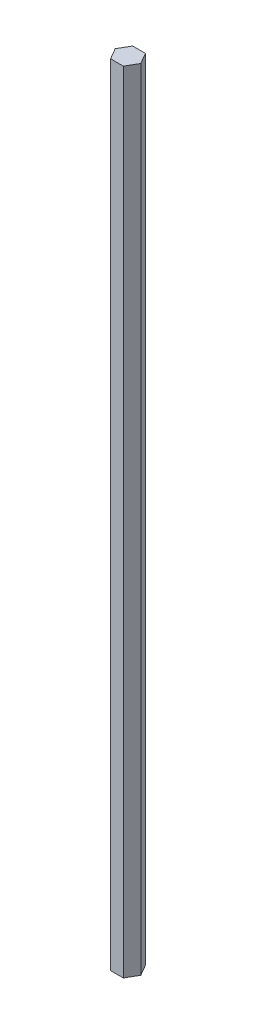
ISO-10303-21;
HEADER;
FILE_DESCRIPTION(('STEP AP214'),'2;1');
FILE_NAME('part.step','',(''),(''),'','','');
FILE_SCHEMA(('AUTOMOTIVE_DESIGN { 1 0 10303 214 1 1 1 1 }'));
ENDSEC;
DATA;
#1=APPLICATION_CONTEXT('core data for automotive mechanical design processes');
#2=APPLICATION_PROTOCOL_DEFINITION('international standard','automotive_design',2000,#1);
#3=PRODUCT_CONTEXT('',#1,'mechanical');
#4=PRODUCT('Part','Part','',(#3));
#5=PRODUCT_RELATED_PRODUCT_CATEGORY('part','',(#4));
#6=PRODUCT_DEFINITION_FORMATION('','',#4);
#7=PRODUCT_DEFINITION_CONTEXT('part definition',#1,'design');
#8=PRODUCT_DEFINITION('design','',#6,#7);
#9=PRODUCT_DEFINITION_SHAPE('','',#8);
#10=(LENGTH_UNIT() NAMED_UNIT(*) SI_UNIT(.MILLI.,.METRE.));
#11=(NAMED_UNIT(*) PLANE_ANGLE_UNIT() SI_UNIT($,.RADIAN.));
#12=(NAMED_UNIT(*) SI_UNIT($,.STERADIAN.) SOLID_ANGLE_UNIT());
#13=UNCERTAINTY_MEASURE_WITH_UNIT(LENGTH_MEASURE(1.E-05),#10,'distance_accuracy_value','');
#14=(GEOMETRIC_REPRESENTATION_CONTEXT(3) GLOBAL_UNCERTAINTY_ASSIGNED_CONTEXT((#13)) GLOBAL_UNIT_ASSIGNED_CONTEXT((#10,
#11,#12)) REPRESENTATION_CONTEXT('',''));
#15=CARTESIAN_POINT('',(0.,0.,0.));
#16=DIRECTION('',(0.,0.,1.));
#17=DIRECTION('',(1.,0.,0.));
#18=AXIS2_PLACEMENT_3D('',#15,#16,#17);
#19=CARTESIAN_POINT('',(2.02072594216369,250.,3.5));
#20=DIRECTION('',(-0.866025403784439,0.,-0.5));
#21=DIRECTION('',(-0.5,0.,0.866025403784439));
#22=AXIS2_PLACEMENT_3D('',#19,#20,#21);
#23=PLANE('',#22);
#24=DIRECTION('',(0.5,0.,-0.866025403784438));
#25=VECTOR('',#24,1.);
#26=CARTESIAN_POINT('',(2.02072594216369,0.,3.5));
#27=LINE('',#26,#25);
#28=CARTESIAN_POINT('',(2.02072594216369,0.,3.5));
#29=VERTEX_POINT('',#28);
#30=CARTESIAN_POINT('',(4.04145188432738,0.,0.));
#31=VERTEX_POINT('',#30);
#32=EDGE_CURVE('E118',#29,#31,#27,.T.);
#33=ORIENTED_EDGE('',*,*,#32,.T.);
#34=DIRECTION('',(0.,-1.,0.));
#35=VECTOR('',#34,1.);
#36=CARTESIAN_POINT('',(4.04145188432738,250.,0.));
#37=LINE('',#36,#35);
#38=CARTESIAN_POINT('',(4.04145188432738,250.,0.));
#39=VERTEX_POINT('',#38);
#40=EDGE_CURVE('E11',#39,#31,#37,.T.);
#41=ORIENTED_EDGE('',*,*,#40,.F.);
#42=DIRECTION('',(0.5,0.,-0.866025403784438));
#43=VECTOR('',#42,1.);
#44=CARTESIAN_POINT('',(2.02072594216369,250.,3.5));
#45=LINE('',#44,#43);
#46=CARTESIAN_POINT('',(2.02072594216369,250.,3.5));
#47=VERTEX_POINT('',#46);
#48=EDGE_CURVE('E128',#47,#39,#45,.T.);
#49=ORIENTED_EDGE('',*,*,#48,.F.);
#50=DIRECTION('',(0.,-1.,0.));
#51=VECTOR('',#50,1.);
#52=CARTESIAN_POINT('',(2.02072594216369,250.,3.5));
#53=LINE('',#52,#51);
#54=EDGE_CURVE('E114',#47,#29,#53,.T.);
#55=ORIENTED_EDGE('',*,*,#54,.T.);
#56=EDGE_LOOP('',(#33,#41,#49,#55));
#57=FACE_BOUND('',#56,.T.);
#58=ADVANCED_FACE('F34',(#57),#23,.F.);
#59=CARTESIAN_POINT('',(4.04145188432738,250.,0.));
#60=DIRECTION('',(-0.866025403784438,0.,0.5));
#61=DIRECTION('',(0.5,0.,0.866025403784438));
#62=AXIS2_PLACEMENT_3D('',#59,#60,#61);
#63=PLANE('',#62);
#64=DIRECTION('',(-0.5,0.,-0.866025403784438));
#65=VECTOR('',#64,1.);
#66=CARTESIAN_POINT('',(4.04145188432738,0.,0.));
#67=LINE('',#66,#65);
#68=CARTESIAN_POINT('',(2.02072594216369,0.,-3.5));
#69=VERTEX_POINT('',#68);
#70=EDGE_CURVE('E121',#31,#69,#67,.T.);
#71=ORIENTED_EDGE('',*,*,#70,.T.);
#72=DIRECTION('',(0.,-1.,0.));
#73=VECTOR('',#72,1.);
#74=CARTESIAN_POINT('',(2.02072594216369,250.,-3.5));
#75=LINE('',#74,#73);
#76=CARTESIAN_POINT('',(2.02072594216369,250.,-3.5));
#77=VERTEX_POINT('',#76);
#78=EDGE_CURVE('E42',#77,#69,#75,.T.);
#79=ORIENTED_EDGE('',*,*,#78,.F.);
#80=DIRECTION('',(-0.5,0.,-0.866025403784438));
#81=VECTOR('',#80,1.);
#82=CARTESIAN_POINT('',(4.04145188432738,250.,0.));
#83=LINE('',#82,#81);
#84=EDGE_CURVE('E87',#39,#77,#83,.T.);
#85=ORIENTED_EDGE('',*,*,#84,.F.);
#86=ORIENTED_EDGE('',*,*,#40,.T.);
#87=EDGE_LOOP('',(#71,#79,#85,#86));
#88=FACE_BOUND('',#87,.T.);
#89=ADVANCED_FACE('F152',(#88),#63,.F.);
#90=CARTESIAN_POINT('',(2.02072594216369,250.,-3.5));
#91=DIRECTION('',(0.,0.,1.));
#92=DIRECTION('',(1.,0.,0.));
#93=AXIS2_PLACEMENT_3D('',#90,#91,#92);
#94=PLANE('',#93);
#95=DIRECTION('',(-1.,0.,0.));
#96=VECTOR('',#95,1.);
#97=CARTESIAN_POINT('',(2.02072594216369,0.,-3.5));
#98=LINE('',#97,#96);
#99=CARTESIAN_POINT('',(-2.02072594216369,0.,-3.5));
#100=VERTEX_POINT('',#99);
#101=EDGE_CURVE('E123',#69,#100,#98,.T.);
#102=ORIENTED_EDGE('',*,*,#101,.T.);
#103=DIRECTION('',(0.,-1.,0.));
#104=VECTOR('',#103,1.);
#105=CARTESIAN_POINT('',(-2.02072594216369,250.,-3.5));
#106=LINE('',#105,#104);
#107=CARTESIAN_POINT('',(-2.02072594216369,250.,-3.5));
#108=VERTEX_POINT('',#107);
#109=EDGE_CURVE('E109',#108,#100,#106,.T.);
#110=ORIENTED_EDGE('',*,*,#109,.F.);
#111=DIRECTION('',(-1.,0.,0.));
#112=VECTOR('',#111,1.);
#113=CARTESIAN_POINT('',(2.02072594216369,250.,-3.5));
#114=LINE('',#113,#112);
#115=EDGE_CURVE('E100',#77,#108,#114,.T.);
#116=ORIENTED_EDGE('',*,*,#115,.F.);
#117=ORIENTED_EDGE('',*,*,#78,.T.);
#118=EDGE_LOOP('',(#102,#110,#116,#117));
#119=FACE_BOUND('',#118,.T.);
#120=ADVANCED_FACE('F134',(#119),#94,.F.);
#121=CARTESIAN_POINT('',(-2.02072594216369,250.,-3.5));
#122=DIRECTION('',(0.866025403784439,0.,0.5));
#123=DIRECTION('',(0.5,0.,-0.866025403784439));
#124=AXIS2_PLACEMENT_3D('',#121,#122,#123);
#125=PLANE('',#124);
#126=DIRECTION('',(-0.5,0.,0.866025403784439));
#127=VECTOR('',#126,1.);
#128=CARTESIAN_POINT('',(-2.02072594216369,0.,-3.5));
#129=LINE('',#128,#127);
#130=CARTESIAN_POINT('',(-4.04145188432738,0.,0.));
#131=VERTEX_POINT('',#130);
#132=EDGE_CURVE('E108',#100,#131,#129,.T.);
#133=ORIENTED_EDGE('',*,*,#132,.T.);
#134=DIRECTION('',(0.,-1.,0.));
#135=VECTOR('',#134,1.);
#136=CARTESIAN_POINT('',(-4.04145188432738,250.,0.));
#137=LINE('',#136,#135);
#138=CARTESIAN_POINT('',(-4.04145188432738,250.,0.));
#139=VERTEX_POINT('',#138);
#140=EDGE_CURVE('E105',#139,#131,#137,.T.);
#141=ORIENTED_EDGE('',*,*,#140,.F.);
#142=DIRECTION('',(-0.5,0.,0.866025403784439));
#143=VECTOR('',#142,1.);
#144=CARTESIAN_POINT('',(-2.02072594216369,250.,-3.5));
#145=LINE('',#144,#143);
#146=EDGE_CURVE('E94',#108,#139,#145,.T.);
#147=ORIENTED_EDGE('',*,*,#146,.F.);
#148=ORIENTED_EDGE('',*,*,#109,.T.);
#149=EDGE_LOOP('',(#133,#141,#147,#148));
#150=FACE_BOUND('',#149,.T.);
#151=ADVANCED_FACE('F106',(#150),#125,.F.);
#152=CARTESIAN_POINT('',(-4.04145188432738,250.,0.));
#153=DIRECTION('',(0.866025403784439,0.,-0.5));
#154=DIRECTION('',(-0.5,0.,-0.866025403784439));
#155=AXIS2_PLACEMENT_3D('',#152,#153,#154);
#156=PLANE('',#155);
#157=DIRECTION('',(0.5,0.,0.866025403784439));
#158=VECTOR('',#157,1.);
#159=CARTESIAN_POINT('',(-4.04145188432738,0.,0.));
#160=LINE('',#159,#158);
#161=CARTESIAN_POINT('',(-2.02072594216369,0.,3.5));
#162=VERTEX_POINT('',#161);
#163=EDGE_CURVE('E73',#131,#162,#160,.T.);
#164=ORIENTED_EDGE('',*,*,#163,.T.);
#165=DIRECTION('',(0.,-1.,0.));
#166=VECTOR('',#165,1.);
#167=CARTESIAN_POINT('',(-2.02072594216369,250.,3.5));
#168=LINE('',#167,#166);
#169=CARTESIAN_POINT('',(-2.02072594216369,250.,3.5));
#170=VERTEX_POINT('',#169);
#171=EDGE_CURVE('E110',#170,#162,#168,.T.);
#172=ORIENTED_EDGE('',*,*,#171,.F.);
#173=DIRECTION('',(0.5,0.,0.866025403784439));
#174=VECTOR('',#173,1.);
#175=CARTESIAN_POINT('',(-4.04145188432738,250.,0.));
#176=LINE('',#175,#174);
#177=EDGE_CURVE('E98',#139,#170,#176,.T.);
#178=ORIENTED_EDGE('',*,*,#177,.F.);
#179=ORIENTED_EDGE('',*,*,#140,.T.);
#180=EDGE_LOOP('',(#164,#172,#178,#179));
#181=FACE_BOUND('',#180,.T.);
#182=ADVANCED_FACE('F112',(#181),#156,.F.);
#183=CARTESIAN_POINT('',(-2.02072594216369,250.,3.5));
#184=DIRECTION('',(0.,0.,-1.));
#185=DIRECTION('',(-1.,0.,0.));
#186=AXIS2_PLACEMENT_3D('',#183,#184,#185);
#187=PLANE('',#186);
#188=DIRECTION('',(1.,0.,0.));
#189=VECTOR('',#188,1.);
#190=CARTESIAN_POINT('',(-2.02072594216369,0.,3.5));
#191=LINE('',#190,#189);
#192=EDGE_CURVE('E79',#162,#29,#191,.T.);
#193=ORIENTED_EDGE('',*,*,#192,.T.);
#194=ORIENTED_EDGE('',*,*,#54,.F.);
#195=DIRECTION('',(1.,0.,0.));
#196=VECTOR('',#195,1.);
#197=CARTESIAN_POINT('',(-2.02072594216369,250.,3.5));
#198=LINE('',#197,#196);
#199=EDGE_CURVE('E50',#170,#47,#198,.T.);
#200=ORIENTED_EDGE('',*,*,#199,.F.);
#201=ORIENTED_EDGE('',*,*,#171,.T.);
#202=EDGE_LOOP('',(#193,#194,#200,#201));
#203=FACE_BOUND('',#202,.T.);
#204=ADVANCED_FACE('F141',(#203),#187,.F.);
#205=CARTESIAN_POINT('',(0.,250.,0.));
#206=DIRECTION('',(0.,1.,0.));
#207=DIRECTION('',(0.,0.,1.));
#208=AXIS2_PLACEMENT_3D('',#205,#206,#207);
#209=PLANE('',#208);
#210=ORIENTED_EDGE('',*,*,#48,.T.);
#211=ORIENTED_EDGE('',*,*,#84,.T.);
#212=ORIENTED_EDGE('',*,*,#115,.T.);
#213=ORIENTED_EDGE('',*,*,#146,.T.);
#214=ORIENTED_EDGE('',*,*,#177,.T.);
#215=ORIENTED_EDGE('',*,*,#199,.T.);
#216=EDGE_LOOP('',(#210,#211,#212,#213,#214,#215));
#217=FACE_BOUND('',#216,.T.);
#218=ADVANCED_FACE('F96',(#217),#209,.T.);
#219=CARTESIAN_POINT('',(0.,0.,0.));
#220=DIRECTION('',(0.,1.,0.));
#221=DIRECTION('',(0.,0.,1.));
#222=AXIS2_PLACEMENT_3D('',#219,#220,#221);
#223=PLANE('',#222);
#224=ORIENTED_EDGE('',*,*,#32,.F.);
#225=ORIENTED_EDGE('',*,*,#192,.F.);
#226=ORIENTED_EDGE('',*,*,#163,.F.);
#227=ORIENTED_EDGE('',*,*,#132,.F.);
#228=ORIENTED_EDGE('',*,*,#101,.F.);
#229=ORIENTED_EDGE('',*,*,#70,.F.);
#230=EDGE_LOOP('',(#224,#225,#226,#227,#228,#229));
#231=FACE_BOUND('',#230,.T.);
#232=ADVANCED_FACE('F137',(#231),#223,.F.);
#233=CLOSED_SHELL('',(#58,#89,#120,#151,#182,#204,#218,#232));
#234=MANIFOLD_SOLID_BREP('B2',#233);
#235=ADVANCED_BREP_SHAPE_REPRESENTATION('',(#18,#234),#14);
#236=SHAPE_DEFINITION_REPRESENTATION(#9,#235);
ENDSEC;
END-ISO-10303-21;
